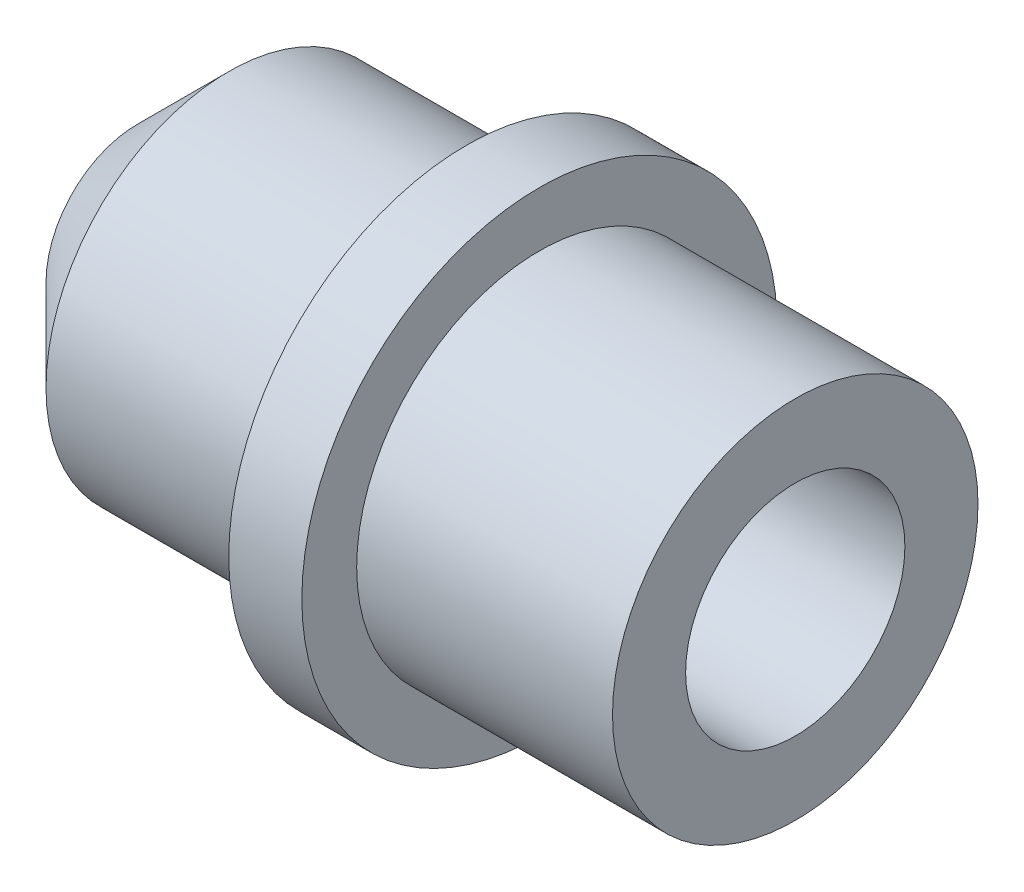
ISO-10303-21;
HEADER;
FILE_DESCRIPTION(('STEP AP214'),'2;1');
FILE_NAME('part.step','',(''),(''),'','','');
FILE_SCHEMA(('AUTOMOTIVE_DESIGN { 1 0 10303 214 1 1 1 1 }'));
ENDSEC;
DATA;
#1=APPLICATION_CONTEXT('core data for automotive mechanical design processes');
#2=APPLICATION_PROTOCOL_DEFINITION('international standard','automotive_design',2000,#1);
#3=PRODUCT_CONTEXT('',#1,'mechanical');
#4=PRODUCT('Part','Part','',(#3));
#5=PRODUCT_RELATED_PRODUCT_CATEGORY('part','',(#4));
#6=PRODUCT_DEFINITION_FORMATION('','',#4);
#7=PRODUCT_DEFINITION_CONTEXT('part definition',#1,'design');
#8=PRODUCT_DEFINITION('design','',#6,#7);
#9=PRODUCT_DEFINITION_SHAPE('','',#8);
#10=(LENGTH_UNIT() NAMED_UNIT(*) SI_UNIT(.MILLI.,.METRE.));
#11=(NAMED_UNIT(*) PLANE_ANGLE_UNIT() SI_UNIT($,.RADIAN.));
#12=(NAMED_UNIT(*) SI_UNIT($,.STERADIAN.) SOLID_ANGLE_UNIT());
#13=UNCERTAINTY_MEASURE_WITH_UNIT(LENGTH_MEASURE(1.E-05),#10,'distance_accuracy_value','');
#14=(GEOMETRIC_REPRESENTATION_CONTEXT(3) GLOBAL_UNCERTAINTY_ASSIGNED_CONTEXT((#13)) GLOBAL_UNIT_ASSIGNED_CONTEXT((#10,
#11,#12)) REPRESENTATION_CONTEXT('',''));
#15=CARTESIAN_POINT('',(0.,0.,0.));
#16=DIRECTION('',(0.,0.,1.));
#17=DIRECTION('',(1.,0.,0.));
#18=AXIS2_PLACEMENT_3D('',#15,#16,#17);
#19=CARTESIAN_POINT('',(-14.1176470588235,0.,0.));
#20=DIRECTION('',(-1.,0.,0.));
#21=DIRECTION('',(0.,0.,1.));
#22=AXIS2_PLACEMENT_3D('',#19,#20,#21);
#23=CYLINDRICAL_SURFACE('',#22,5.);
#24=CARTESIAN_POINT('',(0.372553626783956,0.,0.));
#25=DIRECTION('',(-1.,0.,0.));
#26=DIRECTION('',(0.,0.,1.));
#27=AXIS2_PLACEMENT_3D('',#24,#25,#26);
#28=CIRCLE('',#27,5.);
#29=CARTESIAN_POINT('',(0.372553626783956,0.,5.));
#30=VERTEX_POINT('',#29);
#31=EDGE_CURVE('E10',#30,#30,#28,.T.);
#32=ORIENTED_EDGE('',*,*,#31,.T.);
#33=EDGE_LOOP('',(#32));
#34=FACE_BOUND('',#33,.T.);
#35=CARTESIAN_POINT('',(-6.62744637321604,0.,0.));
#36=DIRECTION('',(-1.,0.,0.));
#37=DIRECTION('',(0.,0.,1.));
#38=AXIS2_PLACEMENT_3D('',#35,#36,#37);
#39=CIRCLE('',#38,5.);
#40=CARTESIAN_POINT('',(-6.62744637321604,0.,5.));
#41=VERTEX_POINT('',#40);
#42=EDGE_CURVE('E70',#41,#41,#39,.T.);
#43=ORIENTED_EDGE('',*,*,#42,.F.);
#44=EDGE_LOOP('',(#43));
#45=FACE_BOUND('',#44,.T.);
#46=ADVANCED_FACE('F33',(#34,#45),#23,.T.);
#47=CARTESIAN_POINT('',(0.372553626783956,0.,3.));
#48=DIRECTION('',(1.,0.,0.));
#49=DIRECTION('',(0.,0.,-1.));
#50=AXIS2_PLACEMENT_3D('',#47,#48,#49);
#51=PLANE('',#50);
#52=CARTESIAN_POINT('',(0.372553626783956,0.,0.));
#53=DIRECTION('',(-1.,0.,0.));
#54=DIRECTION('',(0.,0.,1.));
#55=AXIS2_PLACEMENT_3D('',#52,#53,#54);
#56=CIRCLE('',#55,3.);
#57=CARTESIAN_POINT('',(0.372553626783956,0.,3.));
#58=VERTEX_POINT('',#57);
#59=EDGE_CURVE('E39',#58,#58,#56,.T.);
#60=ORIENTED_EDGE('',*,*,#59,.T.);
#61=EDGE_LOOP('',(#60));
#62=FACE_BOUND('',#61,.T.);
#63=ORIENTED_EDGE('',*,*,#31,.F.);
#64=EDGE_LOOP('',(#63));
#65=FACE_BOUND('',#64,.T.);
#66=ADVANCED_FACE('F78',(#62,#65),#51,.T.);
#67=CARTESIAN_POINT('',(-14.1176470588235,0.,0.));
#68=DIRECTION('',(-1.,0.,0.));
#69=DIRECTION('',(0.,0.,1.));
#70=AXIS2_PLACEMENT_3D('',#67,#68,#69);
#71=CYLINDRICAL_SURFACE('',#70,3.);
#72=CARTESIAN_POINT('',(-14.5366301879446,0.,0.));
#73=DIRECTION('',(-1.,0.,0.));
#74=DIRECTION('',(0.,0.,1.));
#75=AXIS2_PLACEMENT_3D('',#72,#73,#74);
#76=CIRCLE('',#75,3.);
#77=CARTESIAN_POINT('',(-14.5366301879446,0.,3.));
#78=VERTEX_POINT('',#77);
#79=EDGE_CURVE('E43',#78,#78,#76,.T.);
#80=ORIENTED_EDGE('',*,*,#79,.T.);
#81=EDGE_LOOP('',(#80));
#82=FACE_BOUND('',#81,.T.);
#83=ORIENTED_EDGE('',*,*,#59,.F.);
#84=EDGE_LOOP('',(#83));
#85=FACE_BOUND('',#84,.T.);
#86=ADVANCED_FACE('F82',(#82,#85),#71,.F.);
#87=CARTESIAN_POINT('',(-14.5366301879446,0.,1.5));
#88=DIRECTION('',(1.,0.,0.));
#89=DIRECTION('',(0.,0.,-1.));
#90=AXIS2_PLACEMENT_3D('',#87,#88,#89);
#91=PLANE('',#90);
#92=CARTESIAN_POINT('',(-14.5366301879446,0.,0.));
#93=DIRECTION('',(-1.,0.,0.));
#94=DIRECTION('',(0.,0.,1.));
#95=AXIS2_PLACEMENT_3D('',#92,#93,#94);
#96=CIRCLE('',#95,1.5);
#97=CARTESIAN_POINT('',(-14.5366301879446,0.,1.5));
#98=VERTEX_POINT('',#97);
#99=EDGE_CURVE('E47',#98,#98,#96,.T.);
#100=ORIENTED_EDGE('',*,*,#99,.T.);
#101=EDGE_LOOP('',(#100));
#102=FACE_BOUND('',#101,.T.);
#103=ORIENTED_EDGE('',*,*,#79,.F.);
#104=EDGE_LOOP('',(#103));
#105=FACE_BOUND('',#104,.T.);
#106=ADVANCED_FACE('F86',(#102,#105),#91,.T.);
#107=CARTESIAN_POINT('',(-14.1176470588235,0.,0.));
#108=DIRECTION('',(-1.,0.,0.));
#109=DIRECTION('',(0.,0.,1.));
#110=AXIS2_PLACEMENT_3D('',#107,#108,#109);
#111=CYLINDRICAL_SURFACE('',#110,1.5);
#112=CARTESIAN_POINT('',(-17.627446373216,0.,0.));
#113=DIRECTION('',(-1.,0.,0.));
#114=DIRECTION('',(0.,0.,1.));
#115=AXIS2_PLACEMENT_3D('',#112,#113,#114);
#116=CIRCLE('',#115,1.5);
#117=CARTESIAN_POINT('',(-17.627446373216,0.,1.5));
#118=VERTEX_POINT('',#117);
#119=EDGE_CURVE('E52',#118,#118,#116,.T.);
#120=ORIENTED_EDGE('',*,*,#119,.T.);
#121=EDGE_LOOP('',(#120));
#122=FACE_BOUND('',#121,.T.);
#123=ORIENTED_EDGE('',*,*,#99,.F.);
#124=EDGE_LOOP('',(#123));
#125=FACE_BOUND('',#124,.T.);
#126=ADVANCED_FACE('F93',(#122,#125),#111,.F.);
#127=CARTESIAN_POINT('',(-17.627446373216,0.,2.5));
#128=DIRECTION('',(-1.,0.,0.));
#129=DIRECTION('',(0.,0.,1.));
#130=AXIS2_PLACEMENT_3D('',#127,#128,#129);
#131=PLANE('',#130);
#132=CARTESIAN_POINT('',(-17.627446373216,0.,0.));
#133=DIRECTION('',(-1.,0.,0.));
#134=DIRECTION('',(0.,0.,1.));
#135=AXIS2_PLACEMENT_3D('',#132,#133,#134);
#136=CIRCLE('',#135,2.5);
#137=CARTESIAN_POINT('',(-17.627446373216,0.,2.5));
#138=VERTEX_POINT('',#137);
#139=EDGE_CURVE('E55',#138,#138,#136,.T.);
#140=ORIENTED_EDGE('',*,*,#139,.T.);
#141=EDGE_LOOP('',(#140));
#142=FACE_BOUND('',#141,.T.);
#143=ORIENTED_EDGE('',*,*,#119,.F.);
#144=EDGE_LOOP('',(#143));
#145=FACE_BOUND('',#144,.T.);
#146=ADVANCED_FACE('F97',(#142,#145),#131,.T.);
#147=CARTESIAN_POINT('',(-17.627446373216,0.,0.));
#148=DIRECTION('',(1.,0.,0.));
#149=DIRECTION('',(0.,0.,-1.));
#150=AXIS2_PLACEMENT_3D('',#147,#148,#149);
#151=CONICAL_SURFACE('',#150,2.5,0.78539816339745);
#152=CARTESIAN_POINT('',(-15.127446373216,0.,0.));
#153=DIRECTION('',(-1.,0.,0.));
#154=DIRECTION('',(0.,0.,1.));
#155=AXIS2_PLACEMENT_3D('',#152,#153,#154);
#156=CIRCLE('',#155,5.);
#157=CARTESIAN_POINT('',(-15.127446373216,0.,5.));
#158=VERTEX_POINT('',#157);
#159=EDGE_CURVE('E58',#158,#158,#156,.T.);
#160=ORIENTED_EDGE('',*,*,#159,.T.);
#161=EDGE_LOOP('',(#160));
#162=FACE_BOUND('',#161,.T.);
#163=ORIENTED_EDGE('',*,*,#139,.F.);
#164=EDGE_LOOP('',(#163));
#165=FACE_BOUND('',#164,.T.);
#166=ADVANCED_FACE('F101',(#162,#165),#151,.T.);
#167=CARTESIAN_POINT('',(-14.1176470588235,0.,0.));
#168=DIRECTION('',(-1.,0.,0.));
#169=DIRECTION('',(0.,0.,1.));
#170=AXIS2_PLACEMENT_3D('',#167,#168,#169);
#171=CYLINDRICAL_SURFACE('',#170,5.);
#172=CARTESIAN_POINT('',(-8.62744637321604,0.,0.));
#173=DIRECTION('',(-1.,0.,0.));
#174=DIRECTION('',(0.,0.,1.));
#175=AXIS2_PLACEMENT_3D('',#172,#173,#174);
#176=CIRCLE('',#175,5.);
#177=CARTESIAN_POINT('',(-8.62744637321604,0.,5.));
#178=VERTEX_POINT('',#177);
#179=EDGE_CURVE('E61',#178,#178,#176,.T.);
#180=ORIENTED_EDGE('',*,*,#179,.T.);
#181=EDGE_LOOP('',(#180));
#182=FACE_BOUND('',#181,.T.);
#183=ORIENTED_EDGE('',*,*,#159,.F.);
#184=EDGE_LOOP('',(#183));
#185=FACE_BOUND('',#184,.T.);
#186=ADVANCED_FACE('F105',(#182,#185),#171,.T.);
#187=CARTESIAN_POINT('',(-8.62744637321604,0.,6.5));
#188=DIRECTION('',(-1.,0.,0.));
#189=DIRECTION('',(0.,0.,1.));
#190=AXIS2_PLACEMENT_3D('',#187,#188,#189);
#191=PLANE('',#190);
#192=CARTESIAN_POINT('',(-8.62744637321604,0.,0.));
#193=DIRECTION('',(-1.,0.,0.));
#194=DIRECTION('',(0.,0.,1.));
#195=AXIS2_PLACEMENT_3D('',#192,#193,#194);
#196=CIRCLE('',#195,6.5);
#197=CARTESIAN_POINT('',(-8.62744637321604,0.,6.5));
#198=VERTEX_POINT('',#197);
#199=EDGE_CURVE('E64',#198,#198,#196,.T.);
#200=ORIENTED_EDGE('',*,*,#199,.T.);
#201=EDGE_LOOP('',(#200));
#202=FACE_BOUND('',#201,.T.);
#203=ORIENTED_EDGE('',*,*,#179,.F.);
#204=EDGE_LOOP('',(#203));
#205=FACE_BOUND('',#204,.T.);
#206=ADVANCED_FACE('F109',(#202,#205),#191,.T.);
#207=CARTESIAN_POINT('',(-14.1176470588235,0.,0.));
#208=DIRECTION('',(-1.,0.,0.));
#209=DIRECTION('',(0.,0.,1.));
#210=AXIS2_PLACEMENT_3D('',#207,#208,#209);
#211=CYLINDRICAL_SURFACE('',#210,6.5);
#212=CARTESIAN_POINT('',(-6.62744637321604,0.,0.));
#213=DIRECTION('',(-1.,0.,0.));
#214=DIRECTION('',(0.,0.,1.));
#215=AXIS2_PLACEMENT_3D('',#212,#213,#214);
#216=CIRCLE('',#215,6.5);
#217=CARTESIAN_POINT('',(-6.62744637321604,0.,6.5));
#218=VERTEX_POINT('',#217);
#219=EDGE_CURVE('E67',#218,#218,#216,.T.);
#220=ORIENTED_EDGE('',*,*,#219,.T.);
#221=EDGE_LOOP('',(#220));
#222=FACE_BOUND('',#221,.T.);
#223=ORIENTED_EDGE('',*,*,#199,.F.);
#224=EDGE_LOOP('',(#223));
#225=FACE_BOUND('',#224,.T.);
#226=ADVANCED_FACE('F113',(#222,#225),#211,.T.);
#227=CARTESIAN_POINT('',(-6.62744637321604,0.,5.));
#228=DIRECTION('',(1.,0.,0.));
#229=DIRECTION('',(0.,0.,-1.));
#230=AXIS2_PLACEMENT_3D('',#227,#228,#229);
#231=PLANE('',#230);
#232=ORIENTED_EDGE('',*,*,#42,.T.);
#233=EDGE_LOOP('',(#232));
#234=FACE_BOUND('',#233,.T.);
#235=ORIENTED_EDGE('',*,*,#219,.F.);
#236=EDGE_LOOP('',(#235));
#237=FACE_BOUND('',#236,.T.);
#238=ADVANCED_FACE('F74',(#234,#237),#231,.T.);
#239=CLOSED_SHELL('',(#46,#66,#86,#106,#126,#146,#166,#186,#206,#226,#238));
#240=MANIFOLD_SOLID_BREP('B2',#239);
#241=ADVANCED_BREP_SHAPE_REPRESENTATION('',(#18,#240),#14);
#242=SHAPE_DEFINITION_REPRESENTATION(#9,#241);
ENDSEC;
END-ISO-10303-21;
